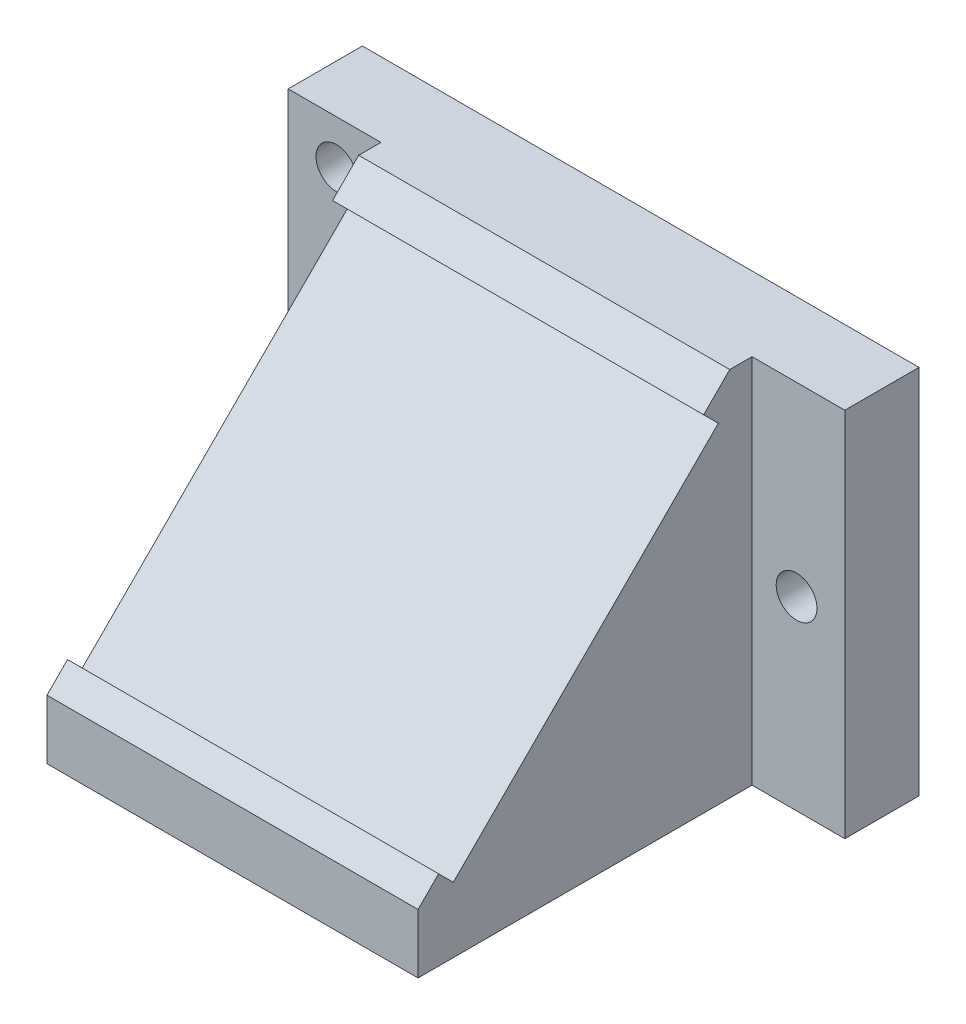
ISO-10303-21;
HEADER;
FILE_DESCRIPTION(('STEP AP214'),'2;1');
FILE_NAME('part.step','',(''),(''),'','','');
FILE_SCHEMA(('AUTOMOTIVE_DESIGN { 1 0 10303 214 1 1 1 1 }'));
ENDSEC;
DATA;
#1=APPLICATION_CONTEXT('core data for automotive mechanical design processes');
#2=APPLICATION_PROTOCOL_DEFINITION('international standard','automotive_design',2000,#1);
#3=PRODUCT_CONTEXT('',#1,'mechanical');
#4=PRODUCT('Part','Part','',(#3));
#5=PRODUCT_RELATED_PRODUCT_CATEGORY('part','',(#4));
#6=PRODUCT_DEFINITION_FORMATION('','',#4);
#7=PRODUCT_DEFINITION_CONTEXT('part definition',#1,'design');
#8=PRODUCT_DEFINITION('design','',#6,#7);
#9=PRODUCT_DEFINITION_SHAPE('','',#8);
#10=(LENGTH_UNIT() NAMED_UNIT(*) SI_UNIT(.MILLI.,.METRE.));
#11=(NAMED_UNIT(*) PLANE_ANGLE_UNIT() SI_UNIT($,.RADIAN.));
#12=(NAMED_UNIT(*) SI_UNIT($,.STERADIAN.) SOLID_ANGLE_UNIT());
#13=UNCERTAINTY_MEASURE_WITH_UNIT(LENGTH_MEASURE(1.E-05),#10,'distance_accuracy_value','');
#14=(GEOMETRIC_REPRESENTATION_CONTEXT(3) GLOBAL_UNCERTAINTY_ASSIGNED_CONTEXT((#13)) GLOBAL_UNIT_ASSIGNED_CONTEXT((#10,
#11,#12)) REPRESENTATION_CONTEXT('',''));
#15=CARTESIAN_POINT('',(0.,0.,0.));
#16=DIRECTION('',(0.,0.,1.));
#17=DIRECTION('',(1.,0.,0.));
#18=AXIS2_PLACEMENT_3D('',#15,#16,#17);
#19=CARTESIAN_POINT('',(25.,14.00000000001,43.));
#20=DIRECTION('',(0.,-1.,0.));
#21=DIRECTION('',(0.,0.,-1.));
#22=AXIS2_PLACEMENT_3D('',#19,#20,#21);
#23=CONICAL_SURFACE('',#22,1.64999999997736,1.02974425867096);
#24=CARTESIAN_POINT('',(25.,14.9914200213743,43.));
#25=VERTEX_POINT('',#24);
#26=VERTEX_LOOP('',#25);
#27=FACE_BOUND('',#26,.T.);
#28=CARTESIAN_POINT('',(25.,14.,43.));
#29=DIRECTION('',(0.,-1.,0.));
#30=DIRECTION('',(0.,0.,-1.));
#31=AXIS2_PLACEMENT_3D('',#28,#29,#30);
#32=CIRCLE('',#31,1.65);
#33=CARTESIAN_POINT('',(25.,14.,41.35));
#34=VERTEX_POINT('',#33);
#35=EDGE_CURVE('E125',#34,#34,#32,.T.);
#36=ORIENTED_EDGE('',*,*,#35,.T.);
#37=EDGE_LOOP('',(#36));
#38=FACE_BOUND('',#37,.T.);
#39=ADVANCED_FACE('F16',(#27,#38),#23,.F.);
#40=CARTESIAN_POINT('',(25.,14.0000000001805,28.));
#41=DIRECTION('',(0.,-1.,0.));
#42=DIRECTION('',(0.,0.,-1.));
#43=AXIS2_PLACEMENT_3D('',#40,#41,#42);
#44=CONICAL_SURFACE('',#43,1.64999999973633,1.02974425847275);
#45=CARTESIAN_POINT('',(25.,14.9914200216017,28.0000000000853));
#46=VERTEX_POINT('',#45);
#47=VERTEX_LOOP('',#46);
#48=FACE_BOUND('',#47,.T.);
#49=CARTESIAN_POINT('',(25.,14.,28.));
#50=DIRECTION('',(0.,-1.,0.));
#51=DIRECTION('',(0.,0.,-1.));
#52=AXIS2_PLACEMENT_3D('',#49,#50,#51);
#53=CIRCLE('',#52,1.65);
#54=CARTESIAN_POINT('',(25.,14.,26.35));
#55=VERTEX_POINT('',#54);
#56=EDGE_CURVE('E127',#55,#55,#53,.T.);
#57=ORIENTED_EDGE('',*,*,#56,.T.);
#58=EDGE_LOOP('',(#57));
#59=FACE_BOUND('',#58,.T.);
#60=ADVANCED_FACE('F122',(#48,#59),#44,.F.);
#61=CARTESIAN_POINT('',(50.,14.00000000001,28.));
#62=DIRECTION('',(0.,-1.,0.));
#63=DIRECTION('',(0.,0.,-1.));
#64=AXIS2_PLACEMENT_3D('',#61,#62,#63);
#65=CONICAL_SURFACE('',#64,1.6500000000774,1.02974425867607);
#66=CARTESIAN_POINT('',(50.,14.9914200214312,28.));
#67=VERTEX_POINT('',#66);
#68=VERTEX_LOOP('',#67);
#69=FACE_BOUND('',#68,.T.);
#70=CARTESIAN_POINT('',(50.,14.,28.));
#71=DIRECTION('',(0.,-1.,0.));
#72=DIRECTION('',(0.,0.,-1.));
#73=AXIS2_PLACEMENT_3D('',#70,#71,#72);
#74=CIRCLE('',#73,1.65);
#75=CARTESIAN_POINT('',(50.,14.,26.35));
#76=VERTEX_POINT('',#75);
#77=EDGE_CURVE('E131',#76,#76,#74,.T.);
#78=ORIENTED_EDGE('',*,*,#77,.T.);
#79=EDGE_LOOP('',(#78));
#80=FACE_BOUND('',#79,.T.);
#81=ADVANCED_FACE('F224',(#69,#80),#65,.F.);
#82=CARTESIAN_POINT('',(50.,14.00000000001,43.));
#83=DIRECTION('',(0.,-1.,0.));
#84=DIRECTION('',(0.,0.,-1.));
#85=AXIS2_PLACEMENT_3D('',#82,#83,#84);
#86=CONICAL_SURFACE('',#85,1.64999999997736,1.02974425867096);
#87=CARTESIAN_POINT('',(50.,14.9914200213743,43.));
#88=VERTEX_POINT('',#87);
#89=VERTEX_LOOP('',#88);
#90=FACE_BOUND('',#89,.T.);
#91=CARTESIAN_POINT('',(50.,14.,43.));
#92=DIRECTION('',(0.,-1.,0.));
#93=DIRECTION('',(0.,0.,-1.));
#94=AXIS2_PLACEMENT_3D('',#91,#92,#93);
#95=CIRCLE('',#94,1.65);
#96=CARTESIAN_POINT('',(50.,14.,41.35));
#97=VERTEX_POINT('',#96);
#98=EDGE_CURVE('E213',#97,#97,#95,.T.);
#99=ORIENTED_EDGE('',*,*,#98,.T.);
#100=EDGE_LOOP('',(#99));
#101=FACE_BOUND('',#100,.T.);
#102=ADVANCED_FACE('F316',(#90,#101),#86,.F.);
#103=CARTESIAN_POINT('',(75.,8.00000000000045,55.));
#104=DIRECTION('',(0.,-0.707106781186551,-0.707106781186544));
#105=DIRECTION('',(0.,0.707106781186544,-0.707106781186551));
#106=AXIS2_PLACEMENT_3D('',#103,#104,#105);
#107=PLANE('',#106);
#108=DIRECTION('',(1.,0.,0.));
#109=VECTOR('',#108,1.);
#110=CARTESIAN_POINT('',(75.001,10.7710065374017,52.2289934625988));
#111=LINE('',#110,#109);
#112=CARTESIAN_POINT('',(62.5,10.7710065374017,52.2289934625988));
#113=VERTEX_POINT('',#112);
#114=CARTESIAN_POINT('',(12.5,10.7710065374017,52.2289934625988));
#115=VERTEX_POINT('',#114);
#116=EDGE_CURVE('E218',#113,#115,#111,.F.);
#117=ORIENTED_EDGE('',*,*,#116,.T.);
#118=DIRECTION('',(0.,-0.707106781186545,0.70710678118655));
#119=VECTOR('',#118,1.);
#120=CARTESIAN_POINT('',(12.5,10.7710065374017,52.2289934625988));
#121=LINE('',#120,#119);
#122=CARTESIAN_POINT('',(12.5,8.00000000000045,55.));
#123=VERTEX_POINT('',#122);
#124=EDGE_CURVE('E209',#115,#123,#121,.T.);
#125=ORIENTED_EDGE('',*,*,#124,.T.);
#126=DIRECTION('',(-1.,0.,0.));
#127=VECTOR('',#126,1.);
#128=CARTESIAN_POINT('',(0.,8.00000000000044,55.));
#129=LINE('',#128,#127);
#130=CARTESIAN_POINT('',(62.5,8.00000000000045,55.));
#131=VERTEX_POINT('',#130);
#132=EDGE_CURVE('E193',#123,#131,#129,.F.);
#133=ORIENTED_EDGE('',*,*,#132,.T.);
#134=DIRECTION('',(0.,0.707106781186551,-0.707106781186544));
#135=VECTOR('',#134,1.);
#136=CARTESIAN_POINT('',(62.5,8.00000000000045,55.));
#137=LINE('',#136,#135);
#138=EDGE_CURVE('E188',#131,#113,#137,.T.);
#139=ORIENTED_EDGE('',*,*,#138,.T.);
#140=EDGE_LOOP('',(#117,#125,#133,#139));
#141=FACE_BOUND('',#140,.T.);
#142=ADVANCED_FACE('F318',(#141),#107,.F.);
#143=CARTESIAN_POINT('',(75.001,10.7710065374017,52.2289934625988));
#144=DIRECTION('',(0.,-0.707106781186548,0.707106781186548));
#145=DIRECTION('',(0.,-0.707106781186548,-0.707106781186548));
#146=AXIS2_PLACEMENT_3D('',#143,#144,#145);
#147=PLANE('',#146);
#148=DIRECTION('',(1.,0.,0.));
#149=VECTOR('',#148,1.);
#150=CARTESIAN_POINT('',(75.001,8.79110755007937,50.2490944752764));
#151=LINE('',#150,#149);
#152=CARTESIAN_POINT('',(62.5,8.79110755007937,50.2490944752764));
#153=VERTEX_POINT('',#152);
#154=CARTESIAN_POINT('',(12.5,8.79110755007936,50.2490944752764));
#155=VERTEX_POINT('',#154);
#156=EDGE_CURVE('E216',#153,#155,#151,.F.);
#157=ORIENTED_EDGE('',*,*,#156,.T.);
#158=DIRECTION('',(0.,0.707106781186536,0.707106781186559));
#159=VECTOR('',#158,1.);
#160=CARTESIAN_POINT('',(12.5,8.79110755007936,50.2490944752764));
#161=LINE('',#160,#159);
#162=EDGE_CURVE('E211',#155,#115,#161,.T.);
#163=ORIENTED_EDGE('',*,*,#162,.T.);
#164=ORIENTED_EDGE('',*,*,#116,.F.);
#165=DIRECTION('',(0.,-0.707106781186548,-0.707106781186548));
#166=VECTOR('',#165,1.);
#167=CARTESIAN_POINT('',(62.5,10.7710065374017,52.2289934625988));
#168=LINE('',#167,#166);
#169=EDGE_CURVE('E186',#113,#153,#168,.T.);
#170=ORIENTED_EDGE('',*,*,#169,.T.);
#171=EDGE_LOOP('',(#157,#163,#164,#170));
#172=FACE_BOUND('',#171,.T.);
#173=ADVANCED_FACE('F325',(#172),#147,.F.);
#174=CARTESIAN_POINT('',(75.001,8.79110755007937,50.2490944752764));
#175=DIRECTION('',(0.,-0.707106781186548,-0.707106781186547));
#176=DIRECTION('',(0.,0.707106781186547,-0.707106781186548));
#177=AXIS2_PLACEMENT_3D('',#174,#175,#176);
#178=PLANE('',#177);
#179=DIRECTION('',(1.,0.,0.));
#180=VECTOR('',#179,1.);
#181=CARTESIAN_POINT('',(75.001,44.5,14.5402020253558));
#182=LINE('',#181,#180);
#183=CARTESIAN_POINT('',(62.5,44.5,14.5402020253558));
#184=VERTEX_POINT('',#183);
#185=CARTESIAN_POINT('',(12.5,44.5,14.5402020253558));
#186=VERTEX_POINT('',#185);
#187=EDGE_CURVE('E133',#184,#186,#182,.F.);
#188=ORIENTED_EDGE('',*,*,#187,.T.);
#189=DIRECTION('',(0.,-0.707106781186547,0.707106781186548));
#190=VECTOR('',#189,1.);
#191=CARTESIAN_POINT('',(12.5,44.5,14.5402020253558));
#192=LINE('',#191,#190);
#193=EDGE_CURVE('E198',#186,#155,#192,.T.);
#194=ORIENTED_EDGE('',*,*,#193,.T.);
#195=ORIENTED_EDGE('',*,*,#156,.F.);
#196=DIRECTION('',(0.,0.707106781186547,-0.707106781186548));
#197=VECTOR('',#196,1.);
#198=CARTESIAN_POINT('',(62.5,8.79110755007937,50.2490944752764));
#199=LINE('',#198,#197);
#200=EDGE_CURVE('E184',#153,#184,#199,.T.);
#201=ORIENTED_EDGE('',*,*,#200,.T.);
#202=EDGE_LOOP('',(#188,#194,#195,#201));
#203=FACE_BOUND('',#202,.T.);
#204=ADVANCED_FACE('F368',(#203),#178,.F.);
#205=CARTESIAN_POINT('',(75.001,44.5,14.5402020253558));
#206=DIRECTION('',(0.,0.707106781186548,-0.707106781186547));
#207=DIRECTION('',(0.,0.707106781186547,0.707106781186548));
#208=AXIS2_PLACEMENT_3D('',#205,#206,#207);
#209=PLANE('',#208);
#210=DIRECTION('',(1.,0.,0.));
#211=VECTOR('',#210,1.);
#212=CARTESIAN_POINT('',(75.,46.4798989873221,16.5201010126779));
#213=LINE('',#212,#211);
#214=CARTESIAN_POINT('',(62.5,46.4798989873223,16.5201010126781));
#215=VERTEX_POINT('',#214);
#216=CARTESIAN_POINT('',(12.5,46.4798989873222,16.520101012678));
#217=VERTEX_POINT('',#216);
#218=EDGE_CURVE('E128',#215,#217,#213,.F.);
#219=ORIENTED_EDGE('',*,*,#218,.T.);
#220=DIRECTION('',(0.,-0.707106781186548,-0.707106781186547));
#221=VECTOR('',#220,1.);
#222=CARTESIAN_POINT('',(12.5,46.4798989873224,16.5201010126781));
#223=LINE('',#222,#221);
#224=EDGE_CURVE('E201',#217,#186,#223,.T.);
#225=ORIENTED_EDGE('',*,*,#224,.T.);
#226=ORIENTED_EDGE('',*,*,#187,.F.);
#227=DIRECTION('',(0.,0.707106781186551,0.707106781186544));
#228=VECTOR('',#227,1.);
#229=CARTESIAN_POINT('',(62.5,44.5,14.5402020253558));
#230=LINE('',#229,#228);
#231=EDGE_CURVE('E178',#184,#215,#230,.T.);
#232=ORIENTED_EDGE('',*,*,#231,.T.);
#233=EDGE_LOOP('',(#219,#225,#226,#232));
#234=FACE_BOUND('',#233,.T.);
#235=ADVANCED_FACE('F256',(#234),#209,.F.);
#236=CARTESIAN_POINT('',(75.,8.00000000000045,55.));
#237=DIRECTION('',(0.,-0.707106781186551,-0.707106781186544));
#238=DIRECTION('',(0.,0.707106781186544,-0.707106781186551));
#239=AXIS2_PLACEMENT_3D('',#236,#237,#238);
#240=PLANE('',#239);
#241=ORIENTED_EDGE('',*,*,#218,.F.);
#242=DIRECTION('',(0.,0.707106781186501,-0.707106781186594));
#243=VECTOR('',#242,1.);
#244=CARTESIAN_POINT('',(62.5,46.4798989873224,16.5201010126781));
#245=LINE('',#244,#243);
#246=CARTESIAN_POINT('',(62.5,50.,13.));
#247=VERTEX_POINT('',#246);
#248=EDGE_CURVE('E172',#215,#247,#245,.T.);
#249=ORIENTED_EDGE('',*,*,#248,.T.);
#250=DIRECTION('',(1.,0.,0.));
#251=VECTOR('',#250,1.);
#252=CARTESIAN_POINT('',(0.,50.,13.));
#253=LINE('',#252,#251);
#254=CARTESIAN_POINT('',(12.5,50.,13.));
#255=VERTEX_POINT('',#254);
#256=EDGE_CURVE('E513',#247,#255,#253,.F.);
#257=ORIENTED_EDGE('',*,*,#256,.T.);
#258=DIRECTION('',(0.,-0.707106781186502,0.707106781186593));
#259=VECTOR('',#258,1.);
#260=CARTESIAN_POINT('',(12.5,50.,13.));
#261=LINE('',#260,#259);
#262=EDGE_CURVE('E204',#255,#217,#261,.T.);
#263=ORIENTED_EDGE('',*,*,#262,.T.);
#264=EDGE_LOOP('',(#241,#249,#257,#263));
#265=FACE_BOUND('',#264,.T.);
#266=ADVANCED_FACE('F247',(#265),#240,.F.);
#267=CARTESIAN_POINT('',(25.,0.,43.));
#268=DIRECTION('',(0.,-1.,0.));
#269=DIRECTION('',(0.,0.,-1.));
#270=AXIS2_PLACEMENT_3D('',#267,#268,#269);
#271=CYLINDRICAL_SURFACE('',#270,1.65);
#272=ORIENTED_EDGE('',*,*,#35,.F.);
#273=EDGE_LOOP('',(#272));
#274=FACE_BOUND('',#273,.T.);
#275=CARTESIAN_POINT('',(25.,0.,43.));
#276=DIRECTION('',(0.,-1.,0.));
#277=DIRECTION('',(0.,0.,-1.));
#278=AXIS2_PLACEMENT_3D('',#275,#276,#277);
#279=CIRCLE('',#278,1.65);
#280=CARTESIAN_POINT('',(25.,0.,41.35));
#281=VERTEX_POINT('',#280);
#282=EDGE_CURVE('E157',#281,#281,#279,.T.);
#283=ORIENTED_EDGE('',*,*,#282,.T.);
#284=EDGE_LOOP('',(#283));
#285=FACE_BOUND('',#284,.T.);
#286=ADVANCED_FACE('F245',(#274,#285),#271,.F.);
#287=CARTESIAN_POINT('',(25.,0.,28.));
#288=DIRECTION('',(0.,-1.,0.));
#289=DIRECTION('',(0.,0.,-1.));
#290=AXIS2_PLACEMENT_3D('',#287,#288,#289);
#291=CYLINDRICAL_SURFACE('',#290,1.65);
#292=ORIENTED_EDGE('',*,*,#56,.F.);
#293=EDGE_LOOP('',(#292));
#294=FACE_BOUND('',#293,.T.);
#295=CARTESIAN_POINT('',(25.,0.,28.));
#296=DIRECTION('',(0.,-1.,0.));
#297=DIRECTION('',(0.,0.,-1.));
#298=AXIS2_PLACEMENT_3D('',#295,#296,#297);
#299=CIRCLE('',#298,1.65);
#300=CARTESIAN_POINT('',(25.,0.,26.35));
#301=VERTEX_POINT('',#300);
#302=EDGE_CURVE('E154',#301,#301,#299,.T.);
#303=ORIENTED_EDGE('',*,*,#302,.T.);
#304=EDGE_LOOP('',(#303));
#305=FACE_BOUND('',#304,.T.);
#306=ADVANCED_FACE('F230',(#294,#305),#291,.F.);
#307=CARTESIAN_POINT('',(50.,0.,28.));
#308=DIRECTION('',(0.,-1.,0.));
#309=DIRECTION('',(0.,0.,-1.));
#310=AXIS2_PLACEMENT_3D('',#307,#308,#309);
#311=CYLINDRICAL_SURFACE('',#310,1.65);
#312=ORIENTED_EDGE('',*,*,#77,.F.);
#313=EDGE_LOOP('',(#312));
#314=FACE_BOUND('',#313,.T.);
#315=CARTESIAN_POINT('',(50.,0.,28.));
#316=DIRECTION('',(0.,-1.,0.));
#317=DIRECTION('',(0.,0.,-1.));
#318=AXIS2_PLACEMENT_3D('',#315,#316,#317);
#319=CIRCLE('',#318,1.65);
#320=CARTESIAN_POINT('',(50.,0.,26.35));
#321=VERTEX_POINT('',#320);
#322=EDGE_CURVE('E151',#321,#321,#319,.T.);
#323=ORIENTED_EDGE('',*,*,#322,.T.);
#324=EDGE_LOOP('',(#323));
#325=FACE_BOUND('',#324,.T.);
#326=ADVANCED_FACE('F226',(#314,#325),#311,.F.);
#327=CARTESIAN_POINT('',(50.,0.,43.));
#328=DIRECTION('',(0.,-1.,0.));
#329=DIRECTION('',(0.,0.,-1.));
#330=AXIS2_PLACEMENT_3D('',#327,#328,#329);
#331=CYLINDRICAL_SURFACE('',#330,1.65);
#332=ORIENTED_EDGE('',*,*,#98,.F.);
#333=EDGE_LOOP('',(#332));
#334=FACE_BOUND('',#333,.T.);
#335=CARTESIAN_POINT('',(50.,0.,43.));
#336=DIRECTION('',(0.,-1.,0.));
#337=DIRECTION('',(0.,0.,-1.));
#338=AXIS2_PLACEMENT_3D('',#335,#336,#337);
#339=CIRCLE('',#338,1.65);
#340=CARTESIAN_POINT('',(50.,0.,41.35));
#341=VERTEX_POINT('',#340);
#342=EDGE_CURVE('E148',#341,#341,#339,.T.);
#343=ORIENTED_EDGE('',*,*,#342,.T.);
#344=EDGE_LOOP('',(#343));
#345=FACE_BOUND('',#344,.T.);
#346=ADVANCED_FACE('F229',(#334,#345),#331,.F.);
#347=CARTESIAN_POINT('',(0.,0.,10.));
#348=DIRECTION('',(0.,0.,1.));
#349=DIRECTION('',(1.,0.,0.));
#350=AXIS2_PLACEMENT_3D('',#347,#348,#349);
#351=PLANE('',#350);
#352=CARTESIAN_POINT('',(6.5,6.00000000000001,10.));
#353=DIRECTION('',(0.,0.,-1.));
#354=DIRECTION('',(-1.,0.,0.));
#355=AXIS2_PLACEMENT_3D('',#352,#353,#354);
#356=CIRCLE('',#355,2.74999999999999);
#357=CARTESIAN_POINT('',(3.75000000000001,6.00000000000001,10.));
#358=VERTEX_POINT('',#357);
#359=EDGE_CURVE('E161',#358,#358,#356,.T.);
#360=ORIENTED_EDGE('',*,*,#359,.T.);
#361=EDGE_LOOP('',(#360));
#362=FACE_BOUND('',#361,.T.);
#363=DIRECTION('',(0.,1.,0.));
#364=VECTOR('',#363,1.);
#365=CARTESIAN_POINT('',(12.5,50.,10.));
#366=LINE('',#365,#364);
#367=CARTESIAN_POINT('',(12.5,0.,10.));
#368=VERTEX_POINT('',#367);
#369=CARTESIAN_POINT('',(12.5,50.,10.));
#370=VERTEX_POINT('',#369);
#371=EDGE_CURVE('E207',#368,#370,#366,.T.);
#372=ORIENTED_EDGE('',*,*,#371,.T.);
#373=DIRECTION('',(1.,0.,0.));
#374=VECTOR('',#373,1.);
#375=CARTESIAN_POINT('',(0.,50.,10.));
#376=LINE('',#375,#374);
#377=CARTESIAN_POINT('',(0.,50.,10.));
#378=VERTEX_POINT('',#377);
#379=EDGE_CURVE('E535',#370,#378,#376,.F.);
#380=ORIENTED_EDGE('',*,*,#379,.T.);
#381=DIRECTION('',(0.,1.,0.));
#382=VECTOR('',#381,1.);
#383=CARTESIAN_POINT('',(0.,0.,10.));
#384=LINE('',#383,#382);
#385=CARTESIAN_POINT('',(0.,0.,10.));
#386=VERTEX_POINT('',#385);
#387=EDGE_CURVE('E163',#378,#386,#384,.F.);
#388=ORIENTED_EDGE('',*,*,#387,.T.);
#389=DIRECTION('',(1.,0.,0.));
#390=VECTOR('',#389,1.);
#391=CARTESIAN_POINT('',(0.,0.,10.));
#392=LINE('',#391,#390);
#393=EDGE_CURVE('E540',#386,#368,#392,.T.);
#394=ORIENTED_EDGE('',*,*,#393,.T.);
#395=EDGE_LOOP('',(#372,#380,#388,#394));
#396=FACE_BOUND('',#395,.T.);
#397=CARTESIAN_POINT('',(6.5,44.,10.));
#398=DIRECTION('',(0.,0.,-1.));
#399=DIRECTION('',(-1.,0.,0.));
#400=AXIS2_PLACEMENT_3D('',#397,#398,#399);
#401=CIRCLE('',#400,2.74999999999999);
#402=CARTESIAN_POINT('',(3.75000000000001,44.,10.));
#403=VERTEX_POINT('',#402);
#404=EDGE_CURVE('E164',#403,#403,#401,.T.);
#405=ORIENTED_EDGE('',*,*,#404,.T.);
#406=EDGE_LOOP('',(#405));
#407=FACE_BOUND('',#406,.T.);
#408=ADVANCED_FACE('F302',(#362,#396,#407),#351,.T.);
#409=CARTESIAN_POINT('',(12.5,50.,10.));
#410=DIRECTION('',(1.,0.,0.));
#411=DIRECTION('',(0.,1.,0.));
#412=AXIS2_PLACEMENT_3D('',#409,#410,#411);
#413=PLANE('',#412);
#414=ORIENTED_EDGE('',*,*,#224,.F.);
#415=ORIENTED_EDGE('',*,*,#262,.F.);
#416=DIRECTION('',(0.,0.,-1.));
#417=VECTOR('',#416,1.);
#418=CARTESIAN_POINT('',(12.5,50.,55.));
#419=LINE('',#418,#417);
#420=EDGE_CURVE('E527',#255,#370,#419,.T.);
#421=ORIENTED_EDGE('',*,*,#420,.T.);
#422=ORIENTED_EDGE('',*,*,#371,.F.);
#423=DIRECTION('',(0.,0.,1.));
#424=VECTOR('',#423,1.);
#425=CARTESIAN_POINT('',(12.5,0.,55.));
#426=LINE('',#425,#424);
#427=CARTESIAN_POINT('',(12.5,0.,55.));
#428=VERTEX_POINT('',#427);
#429=EDGE_CURVE('E550',#368,#428,#426,.T.);
#430=ORIENTED_EDGE('',*,*,#429,.T.);
#431=DIRECTION('',(0.,1.,0.));
#432=VECTOR('',#431,1.);
#433=CARTESIAN_POINT('',(12.5,50.,55.));
#434=LINE('',#433,#432);
#435=EDGE_CURVE('E195',#428,#123,#434,.T.);
#436=ORIENTED_EDGE('',*,*,#435,.T.);
#437=ORIENTED_EDGE('',*,*,#124,.F.);
#438=ORIENTED_EDGE('',*,*,#162,.F.);
#439=ORIENTED_EDGE('',*,*,#193,.F.);
#440=EDGE_LOOP('',(#414,#415,#421,#422,#430,#436,#437,#438,#439));
#441=FACE_BOUND('',#440,.T.);
#442=ADVANCED_FACE('F298',(#441),#413,.F.);
#443=CARTESIAN_POINT('',(0.,50.,55.));
#444=DIRECTION('',(0.,0.,-1.));
#445=DIRECTION('',(-1.,0.,0.));
#446=AXIS2_PLACEMENT_3D('',#443,#444,#445);
#447=PLANE('',#446);
#448=ORIENTED_EDGE('',*,*,#132,.F.);
#449=ORIENTED_EDGE('',*,*,#435,.F.);
#450=DIRECTION('',(1.,0.,0.));
#451=VECTOR('',#450,1.);
#452=CARTESIAN_POINT('',(0.,0.,55.));
#453=LINE('',#452,#451);
#454=CARTESIAN_POINT('',(62.5,0.,55.));
#455=VERTEX_POINT('',#454);
#456=EDGE_CURVE('E552',#428,#455,#453,.T.);
#457=ORIENTED_EDGE('',*,*,#456,.T.);
#458=DIRECTION('',(0.,-1.,0.));
#459=VECTOR('',#458,1.);
#460=CARTESIAN_POINT('',(62.5,50.,55.));
#461=LINE('',#460,#459);
#462=EDGE_CURVE('E190',#455,#131,#461,.F.);
#463=ORIENTED_EDGE('',*,*,#462,.T.);
#464=EDGE_LOOP('',(#448,#449,#457,#463));
#465=FACE_BOUND('',#464,.T.);
#466=ADVANCED_FACE('F295',(#465),#447,.F.);
#467=CARTESIAN_POINT('',(62.5,50.,10.));
#468=DIRECTION('',(-1.,0.,0.));
#469=DIRECTION('',(0.,-1.,0.));
#470=AXIS2_PLACEMENT_3D('',#467,#468,#469);
#471=PLANE('',#470);
#472=ORIENTED_EDGE('',*,*,#231,.F.);
#473=ORIENTED_EDGE('',*,*,#200,.F.);
#474=ORIENTED_EDGE('',*,*,#169,.F.);
#475=ORIENTED_EDGE('',*,*,#138,.F.);
#476=ORIENTED_EDGE('',*,*,#462,.F.);
#477=DIRECTION('',(0.,0.,1.));
#478=VECTOR('',#477,1.);
#479=CARTESIAN_POINT('',(62.5,0.,55.));
#480=LINE('',#479,#478);
#481=CARTESIAN_POINT('',(62.5,0.,10.));
#482=VERTEX_POINT('',#481);
#483=EDGE_CURVE('E569',#455,#482,#480,.F.);
#484=ORIENTED_EDGE('',*,*,#483,.T.);
#485=DIRECTION('',(0.,1.,0.));
#486=VECTOR('',#485,1.);
#487=CARTESIAN_POINT('',(62.5,0.,10.));
#488=LINE('',#487,#486);
#489=CARTESIAN_POINT('',(62.5,50.,10.));
#490=VERTEX_POINT('',#489);
#491=EDGE_CURVE('E169',#482,#490,#488,.T.);
#492=ORIENTED_EDGE('',*,*,#491,.T.);
#493=DIRECTION('',(0.,0.,-1.));
#494=VECTOR('',#493,1.);
#495=CARTESIAN_POINT('',(62.5,50.,55.));
#496=LINE('',#495,#494);
#497=EDGE_CURVE('E522',#490,#247,#496,.F.);
#498=ORIENTED_EDGE('',*,*,#497,.T.);
#499=ORIENTED_EDGE('',*,*,#248,.F.);
#500=EDGE_LOOP('',(#472,#473,#474,#475,#476,#484,#492,#498,#499));
#501=FACE_BOUND('',#500,.T.);
#502=ADVANCED_FACE('F292',(#501),#471,.F.);
#503=CARTESIAN_POINT('',(75.,0.,10.));
#504=DIRECTION('',(0.,0.,-1.));
#505=DIRECTION('',(-1.,0.,0.));
#506=AXIS2_PLACEMENT_3D('',#503,#504,#505);
#507=PLANE('',#506);
#508=CARTESIAN_POINT('',(68.5,25.,10.));
#509=DIRECTION('',(0.,0.,-1.));
#510=DIRECTION('',(-1.,0.,0.));
#511=AXIS2_PLACEMENT_3D('',#508,#509,#510);
#512=CIRCLE('',#511,2.74999999999999);
#513=CARTESIAN_POINT('',(65.75,25.,10.));
#514=VERTEX_POINT('',#513);
#515=EDGE_CURVE('E19',#514,#514,#512,.T.);
#516=ORIENTED_EDGE('',*,*,#515,.T.);
#517=EDGE_LOOP('',(#516));
#518=FACE_BOUND('',#517,.T.);
#519=DIRECTION('',(1.,0.,0.));
#520=VECTOR('',#519,1.);
#521=CARTESIAN_POINT('',(0.,50.,10.));
#522=LINE('',#521,#520);
#523=CARTESIAN_POINT('',(75.,50.,10.));
#524=VERTEX_POINT('',#523);
#525=EDGE_CURVE('E524',#524,#490,#522,.F.);
#526=ORIENTED_EDGE('',*,*,#525,.T.);
#527=ORIENTED_EDGE('',*,*,#491,.F.);
#528=DIRECTION('',(1.,0.,0.));
#529=VECTOR('',#528,1.);
#530=CARTESIAN_POINT('',(0.,0.,10.));
#531=LINE('',#530,#529);
#532=CARTESIAN_POINT('',(75.,0.,10.));
#533=VERTEX_POINT('',#532);
#534=EDGE_CURVE('E147',#482,#533,#531,.T.);
#535=ORIENTED_EDGE('',*,*,#534,.T.);
#536=DIRECTION('',(0.,1.,0.));
#537=VECTOR('',#536,1.);
#538=CARTESIAN_POINT('',(75.,0.,10.));
#539=LINE('',#538,#537);
#540=EDGE_CURVE('E529',#533,#524,#539,.T.);
#541=ORIENTED_EDGE('',*,*,#540,.T.);
#542=EDGE_LOOP('',(#526,#527,#535,#541));
#543=FACE_BOUND('',#542,.T.);
#544=ADVANCED_FACE('F288',(#518,#543),#507,.F.);
#545=CARTESIAN_POINT('',(68.5,25.,0.));
#546=DIRECTION('',(0.,0.,-1.));
#547=DIRECTION('',(-1.,0.,0.));
#548=AXIS2_PLACEMENT_3D('',#545,#546,#547);
#549=CYLINDRICAL_SURFACE('',#548,2.74999999999999);
#550=CARTESIAN_POINT('',(68.5,25.,0.));
#551=DIRECTION('',(0.,0.,-1.));
#552=DIRECTION('',(-1.,0.,0.));
#553=AXIS2_PLACEMENT_3D('',#550,#551,#552);
#554=CIRCLE('',#553,2.74999999999999);
#555=CARTESIAN_POINT('',(65.75,25.,0.));
#556=VERTEX_POINT('',#555);
#557=EDGE_CURVE('E144',#556,#556,#554,.F.);
#558=ORIENTED_EDGE('',*,*,#557,.F.);
#559=EDGE_LOOP('',(#558));
#560=FACE_BOUND('',#559,.T.);
#561=ORIENTED_EDGE('',*,*,#515,.F.);
#562=EDGE_LOOP('',(#561));
#563=FACE_BOUND('',#562,.T.);
#564=ADVANCED_FACE('F284',(#560,#563),#549,.F.);
#565=CARTESIAN_POINT('',(6.5,44.,0.));
#566=DIRECTION('',(0.,0.,-1.));
#567=DIRECTION('',(-1.,0.,0.));
#568=AXIS2_PLACEMENT_3D('',#565,#566,#567);
#569=CYLINDRICAL_SURFACE('',#568,2.74999999999999);
#570=CARTESIAN_POINT('',(6.5,44.,0.));
#571=DIRECTION('',(0.,0.,-1.));
#572=DIRECTION('',(-1.,0.,0.));
#573=AXIS2_PLACEMENT_3D('',#570,#571,#572);
#574=CIRCLE('',#573,2.74999999999999);
#575=CARTESIAN_POINT('',(3.75000000000001,44.,0.));
#576=VERTEX_POINT('',#575);
#577=EDGE_CURVE('E141',#576,#576,#574,.F.);
#578=ORIENTED_EDGE('',*,*,#577,.F.);
#579=EDGE_LOOP('',(#578));
#580=FACE_BOUND('',#579,.T.);
#581=ORIENTED_EDGE('',*,*,#404,.F.);
#582=EDGE_LOOP('',(#581));
#583=FACE_BOUND('',#582,.T.);
#584=ADVANCED_FACE('F280',(#580,#583),#569,.F.);
#585=CARTESIAN_POINT('',(6.5,6.00000000000001,0.));
#586=DIRECTION('',(0.,0.,-1.));
#587=DIRECTION('',(-1.,0.,0.));
#588=AXIS2_PLACEMENT_3D('',#585,#586,#587);
#589=CYLINDRICAL_SURFACE('',#588,2.74999999999999);
#590=CARTESIAN_POINT('',(6.5,6.00000000000001,0.));
#591=DIRECTION('',(0.,0.,-1.));
#592=DIRECTION('',(-1.,0.,0.));
#593=AXIS2_PLACEMENT_3D('',#590,#591,#592);
#594=CIRCLE('',#593,2.74999999999999);
#595=CARTESIAN_POINT('',(3.75000000000001,6.00000000000001,0.));
#596=VERTEX_POINT('',#595);
#597=EDGE_CURVE('E137',#596,#596,#594,.F.);
#598=ORIENTED_EDGE('',*,*,#597,.F.);
#599=EDGE_LOOP('',(#598));
#600=FACE_BOUND('',#599,.T.);
#601=ORIENTED_EDGE('',*,*,#359,.F.);
#602=EDGE_LOOP('',(#601));
#603=FACE_BOUND('',#602,.T.);
#604=ADVANCED_FACE('F276',(#600,#603),#589,.F.);
#605=CARTESIAN_POINT('',(0.,0.,55.));
#606=DIRECTION('',(1.,0.,0.));
#607=DIRECTION('',(0.,0.,-1.));
#608=AXIS2_PLACEMENT_3D('',#605,#606,#607);
#609=PLANE('',#608);
#610=DIRECTION('',(0.,0.,-1.));
#611=VECTOR('',#610,1.);
#612=CARTESIAN_POINT('',(0.,50.,55.));
#613=LINE('',#612,#611);
#614=CARTESIAN_POINT('',(0.,50.,0.));
#615=VERTEX_POINT('',#614);
#616=EDGE_CURVE('E534',#378,#615,#613,.T.);
#617=ORIENTED_EDGE('',*,*,#616,.T.);
#618=DIRECTION('',(0.,1.,0.));
#619=VECTOR('',#618,1.);
#620=CARTESIAN_POINT('',(0.,50.,0.));
#621=LINE('',#620,#619);
#622=CARTESIAN_POINT('',(0.,0.,0.));
#623=VERTEX_POINT('',#622);
#624=EDGE_CURVE('E140',#623,#615,#621,.T.);
#625=ORIENTED_EDGE('',*,*,#624,.F.);
#626=DIRECTION('',(0.,0.,1.));
#627=VECTOR('',#626,1.);
#628=CARTESIAN_POINT('',(0.,0.,55.));
#629=LINE('',#628,#627);
#630=EDGE_CURVE('E544',#623,#386,#629,.T.);
#631=ORIENTED_EDGE('',*,*,#630,.T.);
#632=ORIENTED_EDGE('',*,*,#387,.F.);
#633=EDGE_LOOP('',(#617,#625,#631,#632));
#634=FACE_BOUND('',#633,.T.);
#635=ADVANCED_FACE('F272',(#634),#609,.F.);
#636=CARTESIAN_POINT('',(0.,50.,55.));
#637=DIRECTION('',(0.,-1.,0.));
#638=DIRECTION('',(0.,0.,-1.));
#639=AXIS2_PLACEMENT_3D('',#636,#637,#638);
#640=PLANE('',#639);
#641=ORIENTED_EDGE('',*,*,#256,.F.);
#642=ORIENTED_EDGE('',*,*,#497,.F.);
#643=ORIENTED_EDGE('',*,*,#525,.F.);
#644=DIRECTION('',(0.,0.,1.));
#645=VECTOR('',#644,1.);
#646=CARTESIAN_POINT('',(75.,50.,55.));
#647=LINE('',#646,#645);
#648=CARTESIAN_POINT('',(75.,50.,0.));
#649=VERTEX_POINT('',#648);
#650=EDGE_CURVE('E160',#524,#649,#647,.F.);
#651=ORIENTED_EDGE('',*,*,#650,.T.);
#652=DIRECTION('',(-1.,0.,0.));
#653=VECTOR('',#652,1.);
#654=CARTESIAN_POINT('',(0.,50.,0.));
#655=LINE('',#654,#653);
#656=EDGE_CURVE('E563',#615,#649,#655,.F.);
#657=ORIENTED_EDGE('',*,*,#656,.F.);
#658=ORIENTED_EDGE('',*,*,#616,.F.);
#659=ORIENTED_EDGE('',*,*,#379,.F.);
#660=ORIENTED_EDGE('',*,*,#420,.F.);
#661=EDGE_LOOP('',(#641,#642,#643,#651,#657,#658,#659,#660));
#662=FACE_BOUND('',#661,.T.);
#663=ADVANCED_FACE('F269',(#662),#640,.F.);
#664=CARTESIAN_POINT('',(75.,0.,55.));
#665=DIRECTION('',(-1.,0.,0.));
#666=DIRECTION('',(0.,0.,1.));
#667=AXIS2_PLACEMENT_3D('',#664,#665,#666);
#668=PLANE('',#667);
#669=ORIENTED_EDGE('',*,*,#540,.F.);
#670=DIRECTION('',(0.,0.,1.));
#671=VECTOR('',#670,1.);
#672=CARTESIAN_POINT('',(75.,0.,55.));
#673=LINE('',#672,#671);
#674=CARTESIAN_POINT('',(75.,0.,0.));
#675=VERTEX_POINT('',#674);
#676=EDGE_CURVE('E34',#533,#675,#673,.F.);
#677=ORIENTED_EDGE('',*,*,#676,.T.);
#678=DIRECTION('',(0.,1.,0.));
#679=VECTOR('',#678,1.);
#680=CARTESIAN_POINT('',(75.,50.,0.));
#681=LINE('',#680,#679);
#682=EDGE_CURVE('E25',#649,#675,#681,.F.);
#683=ORIENTED_EDGE('',*,*,#682,.F.);
#684=ORIENTED_EDGE('',*,*,#650,.F.);
#685=EDGE_LOOP('',(#669,#677,#683,#684));
#686=FACE_BOUND('',#685,.T.);
#687=ADVANCED_FACE('F238',(#686),#668,.F.);
#688=CARTESIAN_POINT('',(0.,0.,55.));
#689=DIRECTION('',(0.,1.,0.));
#690=DIRECTION('',(0.,0.,1.));
#691=AXIS2_PLACEMENT_3D('',#688,#689,#690);
#692=PLANE('',#691);
#693=ORIENTED_EDGE('',*,*,#483,.F.);
#694=ORIENTED_EDGE('',*,*,#456,.F.);
#695=ORIENTED_EDGE('',*,*,#429,.F.);
#696=ORIENTED_EDGE('',*,*,#393,.F.);
#697=ORIENTED_EDGE('',*,*,#630,.F.);
#698=DIRECTION('',(-1.,0.,0.));
#699=VECTOR('',#698,1.);
#700=CARTESIAN_POINT('',(0.,0.,0.));
#701=LINE('',#700,#699);
#702=EDGE_CURVE('E11',#675,#623,#701,.T.);
#703=ORIENTED_EDGE('',*,*,#702,.F.);
#704=ORIENTED_EDGE('',*,*,#676,.F.);
#705=ORIENTED_EDGE('',*,*,#534,.F.);
#706=EDGE_LOOP('',(#693,#694,#695,#696,#697,#703,#704,#705));
#707=FACE_BOUND('',#706,.T.);
#708=ORIENTED_EDGE('',*,*,#342,.F.);
#709=EDGE_LOOP('',(#708));
#710=FACE_BOUND('',#709,.T.);
#711=ORIENTED_EDGE('',*,*,#322,.F.);
#712=EDGE_LOOP('',(#711));
#713=FACE_BOUND('',#712,.T.);
#714=ORIENTED_EDGE('',*,*,#302,.F.);
#715=EDGE_LOOP('',(#714));
#716=FACE_BOUND('',#715,.T.);
#717=ORIENTED_EDGE('',*,*,#282,.F.);
#718=EDGE_LOOP('',(#717));
#719=FACE_BOUND('',#718,.T.);
#720=ADVANCED_FACE('F234',(#707,#710,#713,#716,#719),#692,.F.);
#721=CARTESIAN_POINT('',(0.,50.,0.));
#722=DIRECTION('',(0.,0.,-1.));
#723=DIRECTION('',(-1.,0.,0.));
#724=AXIS2_PLACEMENT_3D('',#721,#722,#723);
#725=PLANE('',#724);
#726=ORIENTED_EDGE('',*,*,#682,.T.);
#727=ORIENTED_EDGE('',*,*,#702,.T.);
#728=ORIENTED_EDGE('',*,*,#624,.T.);
#729=ORIENTED_EDGE('',*,*,#656,.T.);
#730=EDGE_LOOP('',(#726,#727,#728,#729));
#731=FACE_BOUND('',#730,.T.);
#732=ORIENTED_EDGE('',*,*,#597,.T.);
#733=EDGE_LOOP('',(#732));
#734=FACE_BOUND('',#733,.T.);
#735=ORIENTED_EDGE('',*,*,#577,.T.);
#736=EDGE_LOOP('',(#735));
#737=FACE_BOUND('',#736,.T.);
#738=ORIENTED_EDGE('',*,*,#557,.T.);
#739=EDGE_LOOP('',(#738));
#740=FACE_BOUND('',#739,.T.);
#741=ADVANCED_FACE('F237',(#731,#734,#737,#740),#725,.T.);
#742=CLOSED_SHELL('',(#39,#60,#81,#102,#142,#173,#204,#235,#266,#286,#306,#326,#346,#408,#442,
#466,#502,#544,#564,#584,#604,#635,#663,#687,#720,#741));
#743=MANIFOLD_SOLID_BREP('B1',#742);
#744=ADVANCED_BREP_SHAPE_REPRESENTATION('',(#18,#743),#14);
#745=SHAPE_DEFINITION_REPRESENTATION(#9,#744);
ENDSEC;
END-ISO-10303-21;
